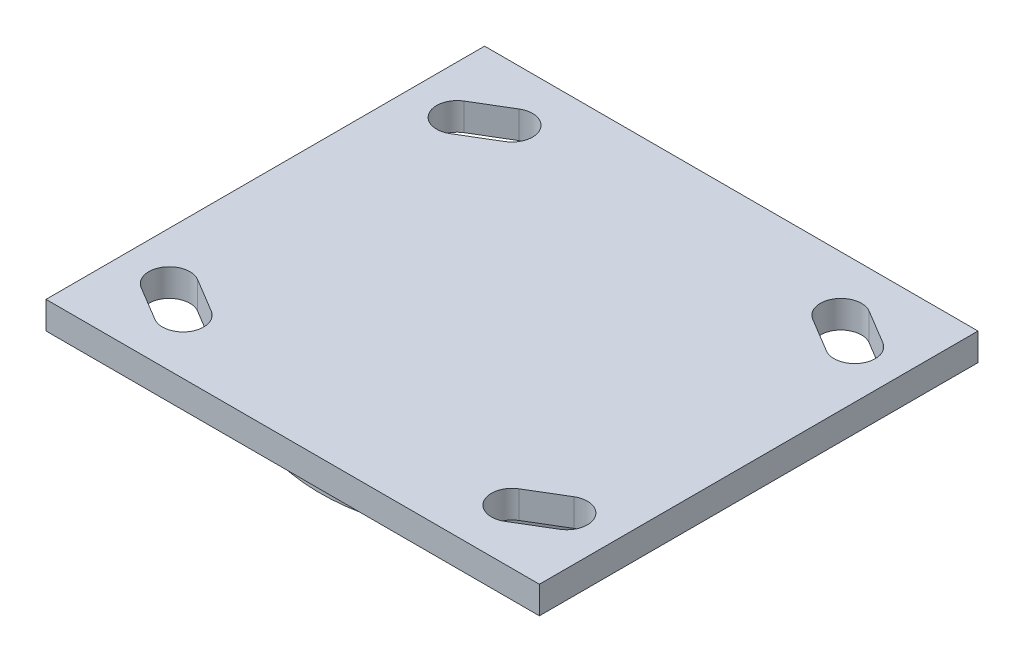
ISO-10303-21;
HEADER;
FILE_DESCRIPTION(('STEP AP214'),'2;1');
FILE_NAME('part.step','',(''),(''),'','','');
FILE_SCHEMA(('AUTOMOTIVE_DESIGN { 1 0 10303 214 1 1 1 1 }'));
ENDSEC;
DATA;
#1=APPLICATION_CONTEXT('core data for automotive mechanical design processes');
#2=APPLICATION_PROTOCOL_DEFINITION('international standard','automotive_design',2000,#1);
#3=PRODUCT_CONTEXT('',#1,'mechanical');
#4=PRODUCT('Part','Part','',(#3));
#5=PRODUCT_RELATED_PRODUCT_CATEGORY('part','',(#4));
#6=PRODUCT_DEFINITION_FORMATION('','',#4);
#7=PRODUCT_DEFINITION_CONTEXT('part definition',#1,'design');
#8=PRODUCT_DEFINITION('design','',#6,#7);
#9=PRODUCT_DEFINITION_SHAPE('','',#8);
#10=(LENGTH_UNIT() NAMED_UNIT(*) SI_UNIT(.MILLI.,.METRE.));
#11=(NAMED_UNIT(*) PLANE_ANGLE_UNIT() SI_UNIT($,.RADIAN.));
#12=(NAMED_UNIT(*) SI_UNIT($,.STERADIAN.) SOLID_ANGLE_UNIT());
#13=UNCERTAINTY_MEASURE_WITH_UNIT(LENGTH_MEASURE(1.E-05),#10,'distance_accuracy_value','');
#14=(GEOMETRIC_REPRESENTATION_CONTEXT(3) GLOBAL_UNCERTAINTY_ASSIGNED_CONTEXT((#13)) GLOBAL_UNIT_ASSIGNED_CONTEXT((#10,
#11,#12)) REPRESENTATION_CONTEXT('',''));
#15=CARTESIAN_POINT('',(0.,0.,0.));
#16=DIRECTION('',(0.,0.,1.));
#17=DIRECTION('',(1.,0.,0.));
#18=AXIS2_PLACEMENT_3D('',#15,#16,#17);
#19=CARTESIAN_POINT('',(40.64,-13.5001,0.));
#20=DIRECTION('',(0.,1.,0.));
#21=DIRECTION('',(-1.,0.,0.));
#22=AXIS2_PLACEMENT_3D('',#19,#20,#21);
#23=PLANE('',#22);
#24=CARTESIAN_POINT('',(0.,-13.5001,0.));
#25=DIRECTION('',(0.,1.,0.));
#26=DIRECTION('',(-1.,0.,0.));
#27=AXIS2_PLACEMENT_3D('',#24,#25,#26);
#28=CIRCLE('',#27,44.45);
#29=CARTESIAN_POINT('',(-44.45,-13.5001,0.));
#30=VERTEX_POINT('',#29);
#31=EDGE_CURVE('E12',#30,#30,#28,.T.);
#32=ORIENTED_EDGE('',*,*,#31,.F.);
#33=EDGE_LOOP('',(#32));
#34=FACE_BOUND('',#33,.T.);
#35=ADVANCED_FACE('F41',(#34),#23,.F.);
#36=CARTESIAN_POINT('',(0.,-6.35,0.));
#37=DIRECTION('',(0.,1.,0.));
#38=DIRECTION('',(-1.,0.,0.));
#39=AXIS2_PLACEMENT_3D('',#36,#37,#38);
#40=CYLINDRICAL_SURFACE('',#39,44.45);
#41=CARTESIAN_POINT('',(0.,-6.35,0.));
#42=DIRECTION('',(0.,1.,0.));
#43=DIRECTION('',(-1.,0.,0.));
#44=AXIS2_PLACEMENT_3D('',#41,#42,#43);
#45=CIRCLE('',#44,44.45);
#46=CARTESIAN_POINT('',(-44.45,-6.35000000000001,0.));
#47=VERTEX_POINT('',#46);
#48=EDGE_CURVE('E48',#47,#47,#45,.T.);
#49=ORIENTED_EDGE('',*,*,#48,.F.);
#50=EDGE_LOOP('',(#49));
#51=FACE_BOUND('',#50,.T.);
#52=ORIENTED_EDGE('',*,*,#31,.T.);
#53=EDGE_LOOP('',(#52));
#54=FACE_BOUND('',#53,.T.);
#55=ADVANCED_FACE('F341',(#51,#54),#40,.T.);
#56=CARTESIAN_POINT('',(-57.15,-6.35,50.8));
#57=DIRECTION('',(0.,1.,0.));
#58=DIRECTION('',(0.,0.,1.));
#59=AXIS2_PLACEMENT_3D('',#56,#57,#58);
#60=PLANE('',#59);
#61=DIRECTION('',(1.,0.,0.));
#62=VECTOR('',#61,1.);
#63=CARTESIAN_POINT('',(-57.15,-6.35,-50.8));
#64=LINE('',#63,#62);
#65=CARTESIAN_POINT('',(-57.15,-6.35,-50.8));
#66=VERTEX_POINT('',#65);
#67=CARTESIAN_POINT('',(57.15,-6.35,-50.8));
#68=VERTEX_POINT('',#67);
#69=EDGE_CURVE('E323',#66,#68,#64,.T.);
#70=ORIENTED_EDGE('',*,*,#69,.T.);
#71=DIRECTION('',(0.,0.,-1.));
#72=VECTOR('',#71,1.);
#73=CARTESIAN_POINT('',(57.15,-6.35,50.8));
#74=LINE('',#73,#72);
#75=CARTESIAN_POINT('',(57.15,-6.35,50.8));
#76=VERTEX_POINT('',#75);
#77=EDGE_CURVE('E333',#76,#68,#74,.T.);
#78=ORIENTED_EDGE('',*,*,#77,.F.);
#79=DIRECTION('',(1.,0.,0.));
#80=VECTOR('',#79,1.);
#81=CARTESIAN_POINT('',(-57.15,-6.35,50.8));
#82=LINE('',#81,#80);
#83=CARTESIAN_POINT('',(-57.15,-6.35,50.8));
#84=VERTEX_POINT('',#83);
#85=EDGE_CURVE('E313',#84,#76,#82,.T.);
#86=ORIENTED_EDGE('',*,*,#85,.F.);
#87=DIRECTION('',(0.,0.,-1.));
#88=VECTOR('',#87,1.);
#89=CARTESIAN_POINT('',(-57.15,-6.35,50.8));
#90=LINE('',#89,#88);
#91=EDGE_CURVE('E336',#84,#66,#90,.T.);
#92=ORIENTED_EDGE('',*,*,#91,.T.);
#93=EDGE_LOOP('',(#70,#78,#86,#92));
#94=FACE_BOUND('',#93,.T.);
#95=DIRECTION('',(0.857492925712546,0.,-0.514495755427524));
#96=VECTOR('',#95,1.);
#97=CARTESIAN_POINT('',(-35.6497139647764,-6.35,-34.016189941294));
#98=LINE('',#97,#96);
#99=CARTESIAN_POINT('',(-43.5872139647764,-6.35,-29.253689941294));
#100=VERTEX_POINT('',#99);
#101=CARTESIAN_POINT('',(-35.6497139647764,-6.35,-34.016189941294));
#102=VERTEX_POINT('',#101);
#103=EDGE_CURVE('E288',#100,#102,#98,.T.);
#104=ORIENTED_EDGE('',*,*,#103,.T.);
#105=CARTESIAN_POINT('',(-38.1,-6.35,-38.1));
#106=DIRECTION('',(0.,1.,0.));
#107=DIRECTION('',(0.,0.,1.));
#108=AXIS2_PLACEMENT_3D('',#105,#106,#107);
#109=CIRCLE('',#108,4.76250000000001);
#110=CARTESIAN_POINT('',(-40.5502860352236,-6.35,-42.183810058706));
#111=VERTEX_POINT('',#110);
#112=EDGE_CURVE('E278',#102,#111,#109,.T.);
#113=ORIENTED_EDGE('',*,*,#112,.T.);
#114=DIRECTION('',(-0.857492925712543,0.,0.514495755427529));
#115=VECTOR('',#114,1.);
#116=CARTESIAN_POINT('',(-40.5502860352236,-6.35,-42.183810058706));
#117=LINE('',#116,#115);
#118=CARTESIAN_POINT('',(-48.4877860352236,-6.35,-37.421310058706));
#119=VERTEX_POINT('',#118);
#120=EDGE_CURVE('E281',#111,#119,#117,.T.);
#121=ORIENTED_EDGE('',*,*,#120,.T.);
#122=CARTESIAN_POINT('',(-46.0375,-6.35,-33.3375));
#123=DIRECTION('',(0.,1.,0.));
#124=DIRECTION('',(0.,0.,1.));
#125=AXIS2_PLACEMENT_3D('',#122,#123,#124);
#126=CIRCLE('',#125,4.76249999999998);
#127=EDGE_CURVE('E285',#119,#100,#126,.T.);
#128=ORIENTED_EDGE('',*,*,#127,.T.);
#129=EDGE_LOOP('',(#104,#113,#121,#128));
#130=FACE_BOUND('',#129,.T.);
#131=DIRECTION('',(0.857492925712543,0.,0.514495755427529));
#132=VECTOR('',#131,1.);
#133=CARTESIAN_POINT('',(-40.5502860352236,-6.35,42.183810058706));
#134=LINE('',#133,#132);
#135=CARTESIAN_POINT('',(-48.4877860352236,-6.35,37.421310058706));
#136=VERTEX_POINT('',#135);
#137=CARTESIAN_POINT('',(-40.5502860352236,-6.35,42.183810058706));
#138=VERTEX_POINT('',#137);
#139=EDGE_CURVE('E256',#136,#138,#134,.T.);
#140=ORIENTED_EDGE('',*,*,#139,.T.);
#141=CARTESIAN_POINT('',(-38.1,-6.35,38.1));
#142=DIRECTION('',(0.,1.,0.));
#143=DIRECTION('',(0.,0.,-1.));
#144=AXIS2_PLACEMENT_3D('',#141,#142,#143);
#145=CIRCLE('',#144,4.76250000000001);
#146=CARTESIAN_POINT('',(-35.6497139647764,-6.35,34.016189941294));
#147=VERTEX_POINT('',#146);
#148=EDGE_CURVE('E246',#138,#147,#145,.T.);
#149=ORIENTED_EDGE('',*,*,#148,.T.);
#150=DIRECTION('',(-0.857492925712546,0.,-0.514495755427524));
#151=VECTOR('',#150,1.);
#152=CARTESIAN_POINT('',(-35.6497139647764,-6.35,34.016189941294));
#153=LINE('',#152,#151);
#154=CARTESIAN_POINT('',(-43.5872139647764,-6.35,29.253689941294));
#155=VERTEX_POINT('',#154);
#156=EDGE_CURVE('E249',#147,#155,#153,.T.);
#157=ORIENTED_EDGE('',*,*,#156,.T.);
#158=CARTESIAN_POINT('',(-46.0375,-6.35,33.3375));
#159=DIRECTION('',(0.,1.,0.));
#160=DIRECTION('',(0.,0.,-1.));
#161=AXIS2_PLACEMENT_3D('',#158,#159,#160);
#162=CIRCLE('',#161,4.76249999999998);
#163=EDGE_CURVE('E253',#155,#136,#162,.T.);
#164=ORIENTED_EDGE('',*,*,#163,.T.);
#165=EDGE_LOOP('',(#140,#149,#157,#164));
#166=FACE_BOUND('',#165,.T.);
#167=DIRECTION('',(-0.857492925712543,0.,-0.514495755427529));
#168=VECTOR('',#167,1.);
#169=CARTESIAN_POINT('',(40.5502860352236,-6.35,-42.183810058706));
#170=LINE('',#169,#168);
#171=CARTESIAN_POINT('',(48.4877860352236,-6.35,-37.421310058706));
#172=VERTEX_POINT('',#171);
#173=CARTESIAN_POINT('',(40.5502860352236,-6.35,-42.183810058706));
#174=VERTEX_POINT('',#173);
#175=EDGE_CURVE('E224',#172,#174,#170,.T.);
#176=ORIENTED_EDGE('',*,*,#175,.T.);
#177=CARTESIAN_POINT('',(38.1,-6.35,-38.1));
#178=DIRECTION('',(0.,1.,0.));
#179=DIRECTION('',(0.,0.,-1.));
#180=AXIS2_PLACEMENT_3D('',#177,#178,#179);
#181=CIRCLE('',#180,4.76250000000001);
#182=CARTESIAN_POINT('',(35.6497139647764,-6.35,-34.016189941294));
#183=VERTEX_POINT('',#182);
#184=EDGE_CURVE('E214',#174,#183,#181,.T.);
#185=ORIENTED_EDGE('',*,*,#184,.T.);
#186=DIRECTION('',(0.857492925712546,0.,0.514495755427524));
#187=VECTOR('',#186,1.);
#188=CARTESIAN_POINT('',(35.6497139647764,-6.35,-34.016189941294));
#189=LINE('',#188,#187);
#190=CARTESIAN_POINT('',(43.5872139647764,-6.35,-29.253689941294));
#191=VERTEX_POINT('',#190);
#192=EDGE_CURVE('E217',#183,#191,#189,.T.);
#193=ORIENTED_EDGE('',*,*,#192,.T.);
#194=CARTESIAN_POINT('',(46.0375,-6.35,-33.3375));
#195=DIRECTION('',(0.,1.,0.));
#196=DIRECTION('',(0.,0.,-1.));
#197=AXIS2_PLACEMENT_3D('',#194,#195,#196);
#198=CIRCLE('',#197,4.76249999999998);
#199=EDGE_CURVE('E221',#191,#172,#198,.T.);
#200=ORIENTED_EDGE('',*,*,#199,.T.);
#201=EDGE_LOOP('',(#176,#185,#193,#200));
#202=FACE_BOUND('',#201,.T.);
#203=DIRECTION('',(-0.857492925712546,0.,0.514495755427524));
#204=VECTOR('',#203,1.);
#205=CARTESIAN_POINT('',(35.6497139647764,-6.35,34.016189941294));
#206=LINE('',#205,#204);
#207=CARTESIAN_POINT('',(43.5872139647764,-6.35,29.253689941294));
#208=VERTEX_POINT('',#207);
#209=CARTESIAN_POINT('',(35.6497139647764,-6.35,34.016189941294));
#210=VERTEX_POINT('',#209);
#211=EDGE_CURVE('E185',#208,#210,#206,.T.);
#212=ORIENTED_EDGE('',*,*,#211,.T.);
#213=CARTESIAN_POINT('',(38.1,-6.35,38.1));
#214=DIRECTION('',(0.,1.,0.));
#215=DIRECTION('',(0.,0.,1.));
#216=AXIS2_PLACEMENT_3D('',#213,#214,#215);
#217=CIRCLE('',#216,4.76250000000001);
#218=CARTESIAN_POINT('',(40.5502860352236,-6.35,42.183810058706));
#219=VERTEX_POINT('',#218);
#220=EDGE_CURVE('E179',#210,#219,#217,.T.);
#221=ORIENTED_EDGE('',*,*,#220,.T.);
#222=DIRECTION('',(0.857492925712543,0.,-0.514495755427529));
#223=VECTOR('',#222,1.);
#224=CARTESIAN_POINT('',(40.5502860352236,-6.35,42.183810058706));
#225=LINE('',#224,#223);
#226=CARTESIAN_POINT('',(48.4877860352236,-6.35,37.421310058706));
#227=VERTEX_POINT('',#226);
#228=EDGE_CURVE('E188',#219,#227,#225,.T.);
#229=ORIENTED_EDGE('',*,*,#228,.T.);
#230=CARTESIAN_POINT('',(46.0375,-6.35,33.3375));
#231=DIRECTION('',(0.,1.,0.));
#232=DIRECTION('',(0.,0.,1.));
#233=AXIS2_PLACEMENT_3D('',#230,#231,#232);
#234=CIRCLE('',#233,4.76249999999998);
#235=EDGE_CURVE('E55',#227,#208,#234,.T.);
#236=ORIENTED_EDGE('',*,*,#235,.T.);
#237=EDGE_LOOP('',(#212,#221,#229,#236));
#238=FACE_BOUND('',#237,.T.);
#239=ORIENTED_EDGE('',*,*,#48,.T.);
#240=EDGE_LOOP('',(#239));
#241=FACE_BOUND('',#240,.T.);
#242=ADVANCED_FACE('F192',(#94,#130,#166,#202,#238,#241),#60,.F.);
#243=CARTESIAN_POINT('',(-57.15,0.,50.8));
#244=DIRECTION('',(1.,0.,0.));
#245=DIRECTION('',(0.,0.,-1.));
#246=AXIS2_PLACEMENT_3D('',#243,#244,#245);
#247=PLANE('',#246);
#248=DIRECTION('',(0.,-1.,0.));
#249=VECTOR('',#248,1.);
#250=CARTESIAN_POINT('',(-57.15,0.,-50.8));
#251=LINE('',#250,#249);
#252=CARTESIAN_POINT('',(-57.15,0.,-50.8));
#253=VERTEX_POINT('',#252);
#254=EDGE_CURVE('E303',#253,#66,#251,.T.);
#255=ORIENTED_EDGE('',*,*,#254,.T.);
#256=ORIENTED_EDGE('',*,*,#91,.F.);
#257=DIRECTION('',(0.,-1.,0.));
#258=VECTOR('',#257,1.);
#259=CARTESIAN_POINT('',(-57.15,0.,50.8));
#260=LINE('',#259,#258);
#261=CARTESIAN_POINT('',(-57.15,0.,50.8));
#262=VERTEX_POINT('',#261);
#263=EDGE_CURVE('E310',#262,#84,#260,.T.);
#264=ORIENTED_EDGE('',*,*,#263,.F.);
#265=DIRECTION('',(0.,0.,-1.));
#266=VECTOR('',#265,1.);
#267=CARTESIAN_POINT('',(-57.15,0.,50.8));
#268=LINE('',#267,#266);
#269=EDGE_CURVE('E320',#262,#253,#268,.T.);
#270=ORIENTED_EDGE('',*,*,#269,.T.);
#271=EDGE_LOOP('',(#255,#256,#264,#270));
#272=FACE_BOUND('',#271,.T.);
#273=ADVANCED_FACE('F360',(#272),#247,.F.);
#274=CARTESIAN_POINT('',(57.15,0.,50.8));
#275=DIRECTION('',(-1.,0.,0.));
#276=DIRECTION('',(0.,0.,1.));
#277=AXIS2_PLACEMENT_3D('',#274,#275,#276);
#278=PLANE('',#277);
#279=DIRECTION('',(0.,1.,0.));
#280=VECTOR('',#279,1.);
#281=CARTESIAN_POINT('',(57.15,0.,-50.8));
#282=LINE('',#281,#280);
#283=CARTESIAN_POINT('',(57.15,0.,-50.8));
#284=VERTEX_POINT('',#283);
#285=EDGE_CURVE('E325',#68,#284,#282,.T.);
#286=ORIENTED_EDGE('',*,*,#285,.T.);
#287=DIRECTION('',(0.,0.,-1.));
#288=VECTOR('',#287,1.);
#289=CARTESIAN_POINT('',(57.15,0.,50.8));
#290=LINE('',#289,#288);
#291=CARTESIAN_POINT('',(57.15,0.,50.8));
#292=VERTEX_POINT('',#291);
#293=EDGE_CURVE('E330',#292,#284,#290,.T.);
#294=ORIENTED_EDGE('',*,*,#293,.F.);
#295=DIRECTION('',(0.,1.,0.));
#296=VECTOR('',#295,1.);
#297=CARTESIAN_POINT('',(57.15,0.,50.8));
#298=LINE('',#297,#296);
#299=EDGE_CURVE('E316',#76,#292,#298,.T.);
#300=ORIENTED_EDGE('',*,*,#299,.F.);
#301=ORIENTED_EDGE('',*,*,#77,.T.);
#302=EDGE_LOOP('',(#286,#294,#300,#301));
#303=FACE_BOUND('',#302,.T.);
#304=ADVANCED_FACE('F367',(#303),#278,.F.);
#305=CARTESIAN_POINT('',(-57.15,0.,50.8));
#306=DIRECTION('',(0.,-1.,0.));
#307=DIRECTION('',(0.,0.,-1.));
#308=AXIS2_PLACEMENT_3D('',#305,#306,#307);
#309=PLANE('',#308);
#310=DIRECTION('',(0.857492925712543,0.,-0.514495755427529));
#311=VECTOR('',#310,1.);
#312=CARTESIAN_POINT('',(40.5502860352236,0.,42.183810058706));
#313=LINE('',#312,#311);
#314=CARTESIAN_POINT('',(40.5502860352236,0.,42.183810058706));
#315=VERTEX_POINT('',#314);
#316=CARTESIAN_POINT('',(48.4877860352236,0.,37.421310058706));
#317=VERTEX_POINT('',#316);
#318=EDGE_CURVE('E204',#315,#317,#313,.T.);
#319=ORIENTED_EDGE('',*,*,#318,.F.);
#320=CARTESIAN_POINT('',(38.1,0.,38.1));
#321=DIRECTION('',(0.,1.,0.));
#322=DIRECTION('',(0.,0.,1.));
#323=AXIS2_PLACEMENT_3D('',#320,#321,#322);
#324=CIRCLE('',#323,4.76250000000001);
#325=CARTESIAN_POINT('',(35.6497139647764,0.,34.016189941294));
#326=VERTEX_POINT('',#325);
#327=EDGE_CURVE('E63',#326,#315,#324,.T.);
#328=ORIENTED_EDGE('',*,*,#327,.F.);
#329=DIRECTION('',(-0.857492925712546,0.,0.514495755427524));
#330=VECTOR('',#329,1.);
#331=CARTESIAN_POINT('',(35.6497139647764,0.,34.016189941294));
#332=LINE('',#331,#330);
#333=CARTESIAN_POINT('',(43.5872139647764,0.,29.253689941294));
#334=VERTEX_POINT('',#333);
#335=EDGE_CURVE('E195',#334,#326,#332,.T.);
#336=ORIENTED_EDGE('',*,*,#335,.F.);
#337=CARTESIAN_POINT('',(46.0375,0.,33.3375));
#338=DIRECTION('',(0.,1.,0.));
#339=DIRECTION('',(0.,0.,1.));
#340=AXIS2_PLACEMENT_3D('',#337,#338,#339);
#341=CIRCLE('',#340,4.76249999999998);
#342=EDGE_CURVE('E198',#317,#334,#341,.T.);
#343=ORIENTED_EDGE('',*,*,#342,.F.);
#344=EDGE_LOOP('',(#319,#328,#336,#343));
#345=FACE_BOUND('',#344,.T.);
#346=DIRECTION('',(0.857492925712546,0.,0.514495755427524));
#347=VECTOR('',#346,1.);
#348=CARTESIAN_POINT('',(35.6497139647764,0.,-34.016189941294));
#349=LINE('',#348,#347);
#350=CARTESIAN_POINT('',(35.6497139647764,0.,-34.016189941294));
#351=VERTEX_POINT('',#350);
#352=CARTESIAN_POINT('',(43.5872139647764,0.,-29.253689941294));
#353=VERTEX_POINT('',#352);
#354=EDGE_CURVE('E229',#351,#353,#349,.T.);
#355=ORIENTED_EDGE('',*,*,#354,.F.);
#356=CARTESIAN_POINT('',(38.1,0.,-38.1));
#357=DIRECTION('',(0.,1.,0.));
#358=DIRECTION('',(0.,0.,-1.));
#359=AXIS2_PLACEMENT_3D('',#356,#357,#358);
#360=CIRCLE('',#359,4.76250000000001);
#361=CARTESIAN_POINT('',(40.5502860352236,0.,-42.183810058706));
#362=VERTEX_POINT('',#361);
#363=EDGE_CURVE('E210',#362,#351,#360,.T.);
#364=ORIENTED_EDGE('',*,*,#363,.F.);
#365=DIRECTION('',(-0.857492925712543,0.,-0.514495755427529));
#366=VECTOR('',#365,1.);
#367=CARTESIAN_POINT('',(40.5502860352236,0.,-42.183810058706));
#368=LINE('',#367,#366);
#369=CARTESIAN_POINT('',(48.4877860352236,0.,-37.421310058706));
#370=VERTEX_POINT('',#369);
#371=EDGE_CURVE('E218',#370,#362,#368,.T.);
#372=ORIENTED_EDGE('',*,*,#371,.F.);
#373=CARTESIAN_POINT('',(46.0375,0.,-33.3375));
#374=DIRECTION('',(0.,1.,0.));
#375=DIRECTION('',(0.,0.,-1.));
#376=AXIS2_PLACEMENT_3D('',#373,#374,#375);
#377=CIRCLE('',#376,4.76249999999998);
#378=EDGE_CURVE('E232',#353,#370,#377,.T.);
#379=ORIENTED_EDGE('',*,*,#378,.F.);
#380=EDGE_LOOP('',(#355,#364,#372,#379));
#381=FACE_BOUND('',#380,.T.);
#382=DIRECTION('',(-0.857492925712546,0.,-0.514495755427524));
#383=VECTOR('',#382,1.);
#384=CARTESIAN_POINT('',(-35.6497139647764,0.,34.016189941294));
#385=LINE('',#384,#383);
#386=CARTESIAN_POINT('',(-35.6497139647764,0.,34.016189941294));
#387=VERTEX_POINT('',#386);
#388=CARTESIAN_POINT('',(-43.5872139647764,0.,29.253689941294));
#389=VERTEX_POINT('',#388);
#390=EDGE_CURVE('E261',#387,#389,#385,.T.);
#391=ORIENTED_EDGE('',*,*,#390,.F.);
#392=CARTESIAN_POINT('',(-38.1,0.,38.1));
#393=DIRECTION('',(0.,1.,0.));
#394=DIRECTION('',(0.,0.,-1.));
#395=AXIS2_PLACEMENT_3D('',#392,#393,#394);
#396=CIRCLE('',#395,4.76250000000001);
#397=CARTESIAN_POINT('',(-40.5502860352236,0.,42.183810058706));
#398=VERTEX_POINT('',#397);
#399=EDGE_CURVE('E239',#398,#387,#396,.T.);
#400=ORIENTED_EDGE('',*,*,#399,.F.);
#401=DIRECTION('',(0.857492925712543,0.,0.514495755427529));
#402=VECTOR('',#401,1.);
#403=CARTESIAN_POINT('',(-40.5502860352236,0.,42.183810058706));
#404=LINE('',#403,#402);
#405=CARTESIAN_POINT('',(-48.4877860352236,0.,37.421310058706));
#406=VERTEX_POINT('',#405);
#407=EDGE_CURVE('E250',#406,#398,#404,.T.);
#408=ORIENTED_EDGE('',*,*,#407,.F.);
#409=CARTESIAN_POINT('',(-46.0375,0.,33.3375));
#410=DIRECTION('',(0.,1.,0.));
#411=DIRECTION('',(0.,0.,-1.));
#412=AXIS2_PLACEMENT_3D('',#409,#410,#411);
#413=CIRCLE('',#412,4.76249999999998);
#414=EDGE_CURVE('E264',#389,#406,#413,.T.);
#415=ORIENTED_EDGE('',*,*,#414,.F.);
#416=EDGE_LOOP('',(#391,#400,#408,#415));
#417=FACE_BOUND('',#416,.T.);
#418=DIRECTION('',(-0.857492925712543,0.,0.514495755427529));
#419=VECTOR('',#418,1.);
#420=CARTESIAN_POINT('',(-40.5502860352236,0.,-42.183810058706));
#421=LINE('',#420,#419);
#422=CARTESIAN_POINT('',(-40.5502860352236,0.,-42.183810058706));
#423=VERTEX_POINT('',#422);
#424=CARTESIAN_POINT('',(-48.4877860352236,0.,-37.421310058706));
#425=VERTEX_POINT('',#424);
#426=EDGE_CURVE('E293',#423,#425,#421,.T.);
#427=ORIENTED_EDGE('',*,*,#426,.F.);
#428=CARTESIAN_POINT('',(-38.1,0.,-38.1));
#429=DIRECTION('',(0.,1.,0.));
#430=DIRECTION('',(0.,0.,1.));
#431=AXIS2_PLACEMENT_3D('',#428,#429,#430);
#432=CIRCLE('',#431,4.76250000000001);
#433=CARTESIAN_POINT('',(-35.6497139647764,0.,-34.016189941294));
#434=VERTEX_POINT('',#433);
#435=EDGE_CURVE('E271',#434,#423,#432,.T.);
#436=ORIENTED_EDGE('',*,*,#435,.F.);
#437=DIRECTION('',(0.857492925712546,0.,-0.514495755427524));
#438=VECTOR('',#437,1.);
#439=CARTESIAN_POINT('',(-35.6497139647764,0.,-34.016189941294));
#440=LINE('',#439,#438);
#441=CARTESIAN_POINT('',(-43.5872139647764,0.,-29.253689941294));
#442=VERTEX_POINT('',#441);
#443=EDGE_CURVE('E282',#442,#434,#440,.T.);
#444=ORIENTED_EDGE('',*,*,#443,.F.);
#445=CARTESIAN_POINT('',(-46.0375,0.,-33.3375));
#446=DIRECTION('',(0.,1.,0.));
#447=DIRECTION('',(0.,0.,1.));
#448=AXIS2_PLACEMENT_3D('',#445,#446,#447);
#449=CIRCLE('',#448,4.76249999999998);
#450=EDGE_CURVE('E296',#425,#442,#449,.T.);
#451=ORIENTED_EDGE('',*,*,#450,.F.);
#452=EDGE_LOOP('',(#427,#436,#444,#451));
#453=FACE_BOUND('',#452,.T.);
#454=DIRECTION('',(-1.,0.,0.));
#455=VECTOR('',#454,1.);
#456=CARTESIAN_POINT('',(-57.15,0.,-50.8));
#457=LINE('',#456,#455);
#458=EDGE_CURVE('E314',#284,#253,#457,.T.);
#459=ORIENTED_EDGE('',*,*,#458,.T.);
#460=ORIENTED_EDGE('',*,*,#269,.F.);
#461=DIRECTION('',(-1.,0.,0.));
#462=VECTOR('',#461,1.);
#463=CARTESIAN_POINT('',(-57.15,0.,50.8));
#464=LINE('',#463,#462);
#465=EDGE_CURVE('E318',#292,#262,#464,.T.);
#466=ORIENTED_EDGE('',*,*,#465,.F.);
#467=ORIENTED_EDGE('',*,*,#293,.T.);
#468=EDGE_LOOP('',(#459,#460,#466,#467));
#469=FACE_BOUND('',#468,.T.);
#470=ADVANCED_FACE('F374',(#345,#381,#417,#453,#469),#309,.F.);
#471=CARTESIAN_POINT('',(-57.15,-6.35,50.8));
#472=DIRECTION('',(0.,0.,1.));
#473=DIRECTION('',(1.,0.,0.));
#474=AXIS2_PLACEMENT_3D('',#471,#472,#473);
#475=PLANE('',#474);
#476=ORIENTED_EDGE('',*,*,#263,.T.);
#477=ORIENTED_EDGE('',*,*,#85,.T.);
#478=ORIENTED_EDGE('',*,*,#299,.T.);
#479=ORIENTED_EDGE('',*,*,#465,.T.);
#480=EDGE_LOOP('',(#476,#477,#478,#479));
#481=FACE_BOUND('',#480,.T.);
#482=ADVANCED_FACE('F381',(#481),#475,.T.);
#483=CARTESIAN_POINT('',(-57.15,-6.35,-50.8));
#484=DIRECTION('',(0.,0.,1.));
#485=DIRECTION('',(1.,0.,0.));
#486=AXIS2_PLACEMENT_3D('',#483,#484,#485);
#487=PLANE('',#486);
#488=ORIENTED_EDGE('',*,*,#254,.F.);
#489=ORIENTED_EDGE('',*,*,#458,.F.);
#490=ORIENTED_EDGE('',*,*,#285,.F.);
#491=ORIENTED_EDGE('',*,*,#69,.F.);
#492=EDGE_LOOP('',(#488,#489,#490,#491));
#493=FACE_BOUND('',#492,.T.);
#494=ADVANCED_FACE('F388',(#493),#487,.F.);
#495=CARTESIAN_POINT('',(-38.1,-6.35,-38.1));
#496=DIRECTION('',(0.,1.,0.));
#497=DIRECTION('',(0.,0.,1.));
#498=AXIS2_PLACEMENT_3D('',#495,#496,#497);
#499=CYLINDRICAL_SURFACE('',#498,4.76250000000001);
#500=ORIENTED_EDGE('',*,*,#435,.T.);
#501=DIRECTION('',(0.,1.,0.));
#502=VECTOR('',#501,1.);
#503=CARTESIAN_POINT('',(-40.5502860352236,-6.35,-42.183810058706));
#504=LINE('',#503,#502);
#505=EDGE_CURVE('E291',#111,#423,#504,.T.);
#506=ORIENTED_EDGE('',*,*,#505,.F.);
#507=ORIENTED_EDGE('',*,*,#112,.F.);
#508=DIRECTION('',(0.,1.,0.));
#509=VECTOR('',#508,1.);
#510=CARTESIAN_POINT('',(-35.6497139647764,-6.35,-34.016189941294));
#511=LINE('',#510,#509);
#512=EDGE_CURVE('E301',#102,#434,#511,.T.);
#513=ORIENTED_EDGE('',*,*,#512,.T.);
#514=EDGE_LOOP('',(#500,#506,#507,#513));
#515=FACE_BOUND('',#514,.T.);
#516=ADVANCED_FACE('F395',(#515),#499,.F.);
#517=CARTESIAN_POINT('',(-35.6497139647764,-6.35,-34.016189941294));
#518=DIRECTION('',(0.514495755427524,0.,0.857492925712546));
#519=DIRECTION('',(0.857492925712546,0.,-0.514495755427524));
#520=AXIS2_PLACEMENT_3D('',#517,#518,#519);
#521=PLANE('',#520);
#522=ORIENTED_EDGE('',*,*,#443,.T.);
#523=ORIENTED_EDGE('',*,*,#512,.F.);
#524=ORIENTED_EDGE('',*,*,#103,.F.);
#525=DIRECTION('',(0.,1.,0.));
#526=VECTOR('',#525,1.);
#527=CARTESIAN_POINT('',(-43.5872139647764,-6.35,-29.253689941294));
#528=LINE('',#527,#526);
#529=EDGE_CURVE('E304',#100,#442,#528,.T.);
#530=ORIENTED_EDGE('',*,*,#529,.T.);
#531=EDGE_LOOP('',(#522,#523,#524,#530));
#532=FACE_BOUND('',#531,.T.);
#533=ADVANCED_FACE('F402',(#532),#521,.F.);
#534=CARTESIAN_POINT('',(-46.0375,-6.35,-33.3375));
#535=DIRECTION('',(0.,1.,0.));
#536=DIRECTION('',(0.,0.,1.));
#537=AXIS2_PLACEMENT_3D('',#534,#535,#536);
#538=CYLINDRICAL_SURFACE('',#537,4.76249999999998);
#539=ORIENTED_EDGE('',*,*,#450,.T.);
#540=ORIENTED_EDGE('',*,*,#529,.F.);
#541=ORIENTED_EDGE('',*,*,#127,.F.);
#542=DIRECTION('',(0.,1.,0.));
#543=VECTOR('',#542,1.);
#544=CARTESIAN_POINT('',(-48.4877860352236,-6.35,-37.421310058706));
#545=LINE('',#544,#543);
#546=EDGE_CURVE('E306',#119,#425,#545,.T.);
#547=ORIENTED_EDGE('',*,*,#546,.T.);
#548=EDGE_LOOP('',(#539,#540,#541,#547));
#549=FACE_BOUND('',#548,.T.);
#550=ADVANCED_FACE('F409',(#549),#538,.F.);
#551=CARTESIAN_POINT('',(-40.5502860352236,-6.35,-42.183810058706));
#552=DIRECTION('',(-0.514495755427529,0.,-0.857492925712543));
#553=DIRECTION('',(-0.857492925712543,0.,0.514495755427529));
#554=AXIS2_PLACEMENT_3D('',#551,#552,#553);
#555=PLANE('',#554);
#556=ORIENTED_EDGE('',*,*,#426,.T.);
#557=ORIENTED_EDGE('',*,*,#546,.F.);
#558=ORIENTED_EDGE('',*,*,#120,.F.);
#559=ORIENTED_EDGE('',*,*,#505,.T.);
#560=EDGE_LOOP('',(#556,#557,#558,#559));
#561=FACE_BOUND('',#560,.T.);
#562=ADVANCED_FACE('F416',(#561),#555,.F.);
#563=CARTESIAN_POINT('',(-38.1,-6.35,38.1));
#564=DIRECTION('',(0.,1.,0.));
#565=DIRECTION('',(0.,0.,1.));
#566=AXIS2_PLACEMENT_3D('',#563,#564,#565);
#567=CYLINDRICAL_SURFACE('',#566,4.76250000000001);
#568=ORIENTED_EDGE('',*,*,#399,.T.);
#569=DIRECTION('',(0.,1.,0.));
#570=VECTOR('',#569,1.);
#571=CARTESIAN_POINT('',(-35.6497139647764,-6.35,34.016189941294));
#572=LINE('',#571,#570);
#573=EDGE_CURVE('E259',#147,#387,#572,.T.);
#574=ORIENTED_EDGE('',*,*,#573,.F.);
#575=ORIENTED_EDGE('',*,*,#148,.F.);
#576=DIRECTION('',(0.,1.,0.));
#577=VECTOR('',#576,1.);
#578=CARTESIAN_POINT('',(-40.5502860352236,-6.35,42.183810058706));
#579=LINE('',#578,#577);
#580=EDGE_CURVE('E269',#138,#398,#579,.T.);
#581=ORIENTED_EDGE('',*,*,#580,.T.);
#582=EDGE_LOOP('',(#568,#574,#575,#581));
#583=FACE_BOUND('',#582,.T.);
#584=ADVANCED_FACE('F423',(#583),#567,.F.);
#585=CARTESIAN_POINT('',(-40.5502860352236,-6.35,42.183810058706));
#586=DIRECTION('',(-0.514495755427529,0.,0.857492925712543));
#587=DIRECTION('',(0.857492925712543,0.,0.514495755427529));
#588=AXIS2_PLACEMENT_3D('',#585,#586,#587);
#589=PLANE('',#588);
#590=ORIENTED_EDGE('',*,*,#407,.T.);
#591=ORIENTED_EDGE('',*,*,#580,.F.);
#592=ORIENTED_EDGE('',*,*,#139,.F.);
#593=DIRECTION('',(0.,1.,0.));
#594=VECTOR('',#593,1.);
#595=CARTESIAN_POINT('',(-48.4877860352236,-6.35,37.421310058706));
#596=LINE('',#595,#594);
#597=EDGE_CURVE('E272',#136,#406,#596,.T.);
#598=ORIENTED_EDGE('',*,*,#597,.T.);
#599=EDGE_LOOP('',(#590,#591,#592,#598));
#600=FACE_BOUND('',#599,.T.);
#601=ADVANCED_FACE('F430',(#600),#589,.F.);
#602=CARTESIAN_POINT('',(-46.0375,-6.35,33.3375));
#603=DIRECTION('',(0.,1.,0.));
#604=DIRECTION('',(0.,0.,1.));
#605=AXIS2_PLACEMENT_3D('',#602,#603,#604);
#606=CYLINDRICAL_SURFACE('',#605,4.76249999999998);
#607=ORIENTED_EDGE('',*,*,#414,.T.);
#608=ORIENTED_EDGE('',*,*,#597,.F.);
#609=ORIENTED_EDGE('',*,*,#163,.F.);
#610=DIRECTION('',(0.,1.,0.));
#611=VECTOR('',#610,1.);
#612=CARTESIAN_POINT('',(-43.5872139647764,-6.35,29.253689941294));
#613=LINE('',#612,#611);
#614=EDGE_CURVE('E274',#155,#389,#613,.T.);
#615=ORIENTED_EDGE('',*,*,#614,.T.);
#616=EDGE_LOOP('',(#607,#608,#609,#615));
#617=FACE_BOUND('',#616,.T.);
#618=ADVANCED_FACE('F437',(#617),#606,.F.);
#619=CARTESIAN_POINT('',(-35.6497139647764,-6.35,34.016189941294));
#620=DIRECTION('',(0.514495755427524,0.,-0.857492925712546));
#621=DIRECTION('',(-0.857492925712546,0.,-0.514495755427524));
#622=AXIS2_PLACEMENT_3D('',#619,#620,#621);
#623=PLANE('',#622);
#624=ORIENTED_EDGE('',*,*,#390,.T.);
#625=ORIENTED_EDGE('',*,*,#614,.F.);
#626=ORIENTED_EDGE('',*,*,#156,.F.);
#627=ORIENTED_EDGE('',*,*,#573,.T.);
#628=EDGE_LOOP('',(#624,#625,#626,#627));
#629=FACE_BOUND('',#628,.T.);
#630=ADVANCED_FACE('F444',(#629),#623,.F.);
#631=CARTESIAN_POINT('',(38.1,-6.35,-38.1));
#632=DIRECTION('',(0.,1.,0.));
#633=DIRECTION('',(0.,0.,1.));
#634=AXIS2_PLACEMENT_3D('',#631,#632,#633);
#635=CYLINDRICAL_SURFACE('',#634,4.76250000000001);
#636=ORIENTED_EDGE('',*,*,#363,.T.);
#637=DIRECTION('',(0.,1.,0.));
#638=VECTOR('',#637,1.);
#639=CARTESIAN_POINT('',(35.6497139647764,-6.35,-34.016189941294));
#640=LINE('',#639,#638);
#641=EDGE_CURVE('E227',#183,#351,#640,.T.);
#642=ORIENTED_EDGE('',*,*,#641,.F.);
#643=ORIENTED_EDGE('',*,*,#184,.F.);
#644=DIRECTION('',(0.,1.,0.));
#645=VECTOR('',#644,1.);
#646=CARTESIAN_POINT('',(40.5502860352236,-6.35,-42.183810058706));
#647=LINE('',#646,#645);
#648=EDGE_CURVE('E237',#174,#362,#647,.T.);
#649=ORIENTED_EDGE('',*,*,#648,.T.);
#650=EDGE_LOOP('',(#636,#642,#643,#649));
#651=FACE_BOUND('',#650,.T.);
#652=ADVANCED_FACE('F451',(#651),#635,.F.);
#653=CARTESIAN_POINT('',(40.5502860352236,-6.35,-42.183810058706));
#654=DIRECTION('',(0.514495755427529,0.,-0.857492925712543));
#655=DIRECTION('',(-0.857492925712543,0.,-0.514495755427529));
#656=AXIS2_PLACEMENT_3D('',#653,#654,#655);
#657=PLANE('',#656);
#658=ORIENTED_EDGE('',*,*,#371,.T.);
#659=ORIENTED_EDGE('',*,*,#648,.F.);
#660=ORIENTED_EDGE('',*,*,#175,.F.);
#661=DIRECTION('',(0.,1.,0.));
#662=VECTOR('',#661,1.);
#663=CARTESIAN_POINT('',(48.4877860352236,-6.35,-37.421310058706));
#664=LINE('',#663,#662);
#665=EDGE_CURVE('E240',#172,#370,#664,.T.);
#666=ORIENTED_EDGE('',*,*,#665,.T.);
#667=EDGE_LOOP('',(#658,#659,#660,#666));
#668=FACE_BOUND('',#667,.T.);
#669=ADVANCED_FACE('F458',(#668),#657,.F.);
#670=CARTESIAN_POINT('',(46.0375,-6.35,-33.3375));
#671=DIRECTION('',(0.,1.,0.));
#672=DIRECTION('',(0.,0.,1.));
#673=AXIS2_PLACEMENT_3D('',#670,#671,#672);
#674=CYLINDRICAL_SURFACE('',#673,4.76249999999998);
#675=ORIENTED_EDGE('',*,*,#378,.T.);
#676=ORIENTED_EDGE('',*,*,#665,.F.);
#677=ORIENTED_EDGE('',*,*,#199,.F.);
#678=DIRECTION('',(0.,1.,0.));
#679=VECTOR('',#678,1.);
#680=CARTESIAN_POINT('',(43.5872139647764,-6.35,-29.253689941294));
#681=LINE('',#680,#679);
#682=EDGE_CURVE('E242',#191,#353,#681,.T.);
#683=ORIENTED_EDGE('',*,*,#682,.T.);
#684=EDGE_LOOP('',(#675,#676,#677,#683));
#685=FACE_BOUND('',#684,.T.);
#686=ADVANCED_FACE('F465',(#685),#674,.F.);
#687=CARTESIAN_POINT('',(35.6497139647764,-6.35,-34.016189941294));
#688=DIRECTION('',(-0.514495755427524,0.,0.857492925712546));
#689=DIRECTION('',(0.857492925712546,0.,0.514495755427524));
#690=AXIS2_PLACEMENT_3D('',#687,#688,#689);
#691=PLANE('',#690);
#692=ORIENTED_EDGE('',*,*,#354,.T.);
#693=ORIENTED_EDGE('',*,*,#682,.F.);
#694=ORIENTED_EDGE('',*,*,#192,.F.);
#695=ORIENTED_EDGE('',*,*,#641,.T.);
#696=EDGE_LOOP('',(#692,#693,#694,#695));
#697=FACE_BOUND('',#696,.T.);
#698=ADVANCED_FACE('F472',(#697),#691,.F.);
#699=CARTESIAN_POINT('',(38.1,-6.35,38.1));
#700=DIRECTION('',(0.,1.,0.));
#701=DIRECTION('',(0.,0.,1.));
#702=AXIS2_PLACEMENT_3D('',#699,#700,#701);
#703=CYLINDRICAL_SURFACE('',#702,4.76250000000001);
#704=ORIENTED_EDGE('',*,*,#327,.T.);
#705=DIRECTION('',(0.,1.,0.));
#706=VECTOR('',#705,1.);
#707=CARTESIAN_POINT('',(40.5502860352236,-6.35,42.183810058706));
#708=LINE('',#707,#706);
#709=EDGE_CURVE('E175',#219,#315,#708,.T.);
#710=ORIENTED_EDGE('',*,*,#709,.F.);
#711=ORIENTED_EDGE('',*,*,#220,.F.);
#712=DIRECTION('',(0.,1.,0.));
#713=VECTOR('',#712,1.);
#714=CARTESIAN_POINT('',(35.6497139647764,-6.35,34.016189941294));
#715=LINE('',#714,#713);
#716=EDGE_CURVE('E208',#210,#326,#715,.T.);
#717=ORIENTED_EDGE('',*,*,#716,.T.);
#718=EDGE_LOOP('',(#704,#710,#711,#717));
#719=FACE_BOUND('',#718,.T.);
#720=ADVANCED_FACE('F177',(#719),#703,.F.);
#721=CARTESIAN_POINT('',(35.6497139647764,-6.35,34.016189941294));
#722=DIRECTION('',(-0.514495755427524,0.,-0.857492925712546));
#723=DIRECTION('',(-0.857492925712546,0.,0.514495755427524));
#724=AXIS2_PLACEMENT_3D('',#721,#722,#723);
#725=PLANE('',#724);
#726=ORIENTED_EDGE('',*,*,#335,.T.);
#727=ORIENTED_EDGE('',*,*,#716,.F.);
#728=ORIENTED_EDGE('',*,*,#211,.F.);
#729=DIRECTION('',(0.,1.,0.));
#730=VECTOR('',#729,1.);
#731=CARTESIAN_POINT('',(43.5872139647764,-6.35,29.253689941294));
#732=LINE('',#731,#730);
#733=EDGE_CURVE('E211',#208,#334,#732,.T.);
#734=ORIENTED_EDGE('',*,*,#733,.T.);
#735=EDGE_LOOP('',(#726,#727,#728,#734));
#736=FACE_BOUND('',#735,.T.);
#737=ADVANCED_FACE('F485',(#736),#725,.F.);
#738=CARTESIAN_POINT('',(46.0375,-6.35,33.3375));
#739=DIRECTION('',(0.,1.,0.));
#740=DIRECTION('',(0.,0.,1.));
#741=AXIS2_PLACEMENT_3D('',#738,#739,#740);
#742=CYLINDRICAL_SURFACE('',#741,4.76249999999998);
#743=ORIENTED_EDGE('',*,*,#342,.T.);
#744=ORIENTED_EDGE('',*,*,#733,.F.);
#745=ORIENTED_EDGE('',*,*,#235,.F.);
#746=DIRECTION('',(0.,1.,0.));
#747=VECTOR('',#746,1.);
#748=CARTESIAN_POINT('',(48.4877860352236,-6.35,37.421310058706));
#749=LINE('',#748,#747);
#750=EDGE_CURVE('E184',#227,#317,#749,.T.);
#751=ORIENTED_EDGE('',*,*,#750,.T.);
#752=EDGE_LOOP('',(#743,#744,#745,#751));
#753=FACE_BOUND('',#752,.T.);
#754=ADVANCED_FACE('F491',(#753),#742,.F.);
#755=CARTESIAN_POINT('',(40.5502860352236,-6.35,42.183810058706));
#756=DIRECTION('',(0.514495755427529,0.,0.857492925712543));
#757=DIRECTION('',(0.857492925712543,0.,-0.514495755427529));
#758=AXIS2_PLACEMENT_3D('',#755,#756,#757);
#759=PLANE('',#758);
#760=ORIENTED_EDGE('',*,*,#318,.T.);
#761=ORIENTED_EDGE('',*,*,#750,.F.);
#762=ORIENTED_EDGE('',*,*,#228,.F.);
#763=ORIENTED_EDGE('',*,*,#709,.T.);
#764=EDGE_LOOP('',(#760,#761,#762,#763));
#765=FACE_BOUND('',#764,.T.);
#766=ADVANCED_FACE('F189',(#765),#759,.F.);
#767=CLOSED_SHELL('',(#35,#55,#242,#273,#304,#470,#482,#494,#516,#533,#550,#562,#584,#601,#618,
#630,#652,#669,#686,#698,#720,#737,#754,#766));
#768=MANIFOLD_SOLID_BREP('B2',#767);
#769=ADVANCED_BREP_SHAPE_REPRESENTATION('',(#18,#768),#14);
#770=SHAPE_DEFINITION_REPRESENTATION(#9,#769);
ENDSEC;
END-ISO-10303-21;
